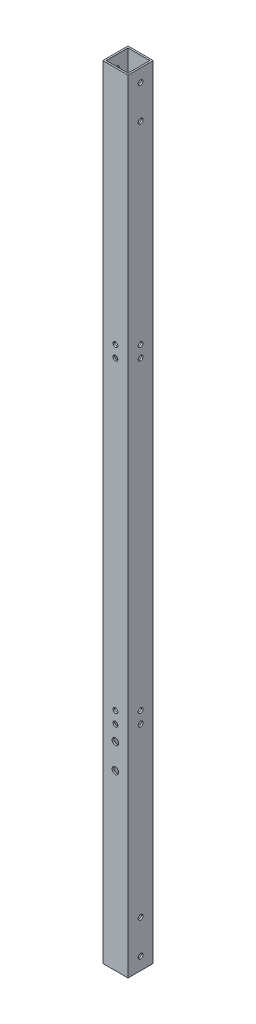
ISO-10303-21;
HEADER;
FILE_DESCRIPTION(('STEP AP214'),'2;1');
FILE_NAME('part.step','',(''),(''),'','','');
FILE_SCHEMA(('AUTOMOTIVE_DESIGN { 1 0 10303 214 1 1 1 1 }'));
ENDSEC;
DATA;
#1=APPLICATION_CONTEXT('core data for automotive mechanical design processes');
#2=APPLICATION_PROTOCOL_DEFINITION('international standard','automotive_design',2000,#1);
#3=PRODUCT_CONTEXT('',#1,'mechanical');
#4=PRODUCT('Part','Part','',(#3));
#5=PRODUCT_RELATED_PRODUCT_CATEGORY('part','',(#4));
#6=PRODUCT_DEFINITION_FORMATION('','',#4);
#7=PRODUCT_DEFINITION_CONTEXT('part definition',#1,'design');
#8=PRODUCT_DEFINITION('design','',#6,#7);
#9=PRODUCT_DEFINITION_SHAPE('','',#8);
#10=(LENGTH_UNIT() NAMED_UNIT(*) SI_UNIT(.MILLI.,.METRE.));
#11=(NAMED_UNIT(*) PLANE_ANGLE_UNIT() SI_UNIT($,.RADIAN.));
#12=(NAMED_UNIT(*) SI_UNIT($,.STERADIAN.) SOLID_ANGLE_UNIT());
#13=UNCERTAINTY_MEASURE_WITH_UNIT(LENGTH_MEASURE(1.E-05),#10,'distance_accuracy_value','');
#14=(GEOMETRIC_REPRESENTATION_CONTEXT(3) GLOBAL_UNCERTAINTY_ASSIGNED_CONTEXT((#13)) GLOBAL_UNIT_ASSIGNED_CONTEXT((#10,
#11,#12)) REPRESENTATION_CONTEXT('',''));
#15=CARTESIAN_POINT('',(0.,0.,0.));
#16=DIRECTION('',(0.,0.,1.));
#17=DIRECTION('',(1.,0.,0.));
#18=AXIS2_PLACEMENT_3D('',#15,#16,#17);
#19=CARTESIAN_POINT('',(0.,465.,0.));
#20=DIRECTION('',(0.,1.,0.));
#21=DIRECTION('',(0.,0.,1.));
#22=AXIS2_PLACEMENT_3D('',#19,#20,#21);
#23=PLANE('',#22);
#24=DIRECTION('',(0.,0.,-1.));
#25=VECTOR('',#24,1.);
#26=CARTESIAN_POINT('',(7.5,465.,7.5));
#27=LINE('',#26,#25);
#28=CARTESIAN_POINT('',(7.5,465.,7.5));
#29=VERTEX_POINT('',#28);
#30=CARTESIAN_POINT('',(7.5,465.,-7.5));
#31=VERTEX_POINT('',#30);
#32=EDGE_CURVE('E187',#29,#31,#27,.T.);
#33=ORIENTED_EDGE('',*,*,#32,.T.);
#34=DIRECTION('',(-1.,0.,0.));
#35=VECTOR('',#34,1.);
#36=CARTESIAN_POINT('',(-7.5,465.,-7.5));
#37=LINE('',#36,#35);
#38=CARTESIAN_POINT('',(-7.5,465.,-7.5));
#39=VERTEX_POINT('',#38);
#40=EDGE_CURVE('E191',#31,#39,#37,.T.);
#41=ORIENTED_EDGE('',*,*,#40,.T.);
#42=DIRECTION('',(0.,0.,1.));
#43=VECTOR('',#42,1.);
#44=CARTESIAN_POINT('',(-7.5,465.,7.5));
#45=LINE('',#44,#43);
#46=CARTESIAN_POINT('',(-7.5,465.,7.5));
#47=VERTEX_POINT('',#46);
#48=EDGE_CURVE('E195',#39,#47,#45,.T.);
#49=ORIENTED_EDGE('',*,*,#48,.T.);
#50=DIRECTION('',(1.,0.,0.));
#51=VECTOR('',#50,1.);
#52=CARTESIAN_POINT('',(-7.5,465.,7.5));
#53=LINE('',#52,#51);
#54=EDGE_CURVE('E198',#47,#29,#53,.T.);
#55=ORIENTED_EDGE('',*,*,#54,.T.);
#56=EDGE_LOOP('',(#33,#41,#49,#55));
#57=FACE_BOUND('',#56,.T.);
#58=DIRECTION('',(-1.,0.,0.));
#59=VECTOR('',#58,1.);
#60=CARTESIAN_POINT('',(0.,465.,-6.5));
#61=LINE('',#60,#59);
#62=CARTESIAN_POINT('',(6.5,465.,-6.5));
#63=VERTEX_POINT('',#62);
#64=CARTESIAN_POINT('',(-6.5,465.,-6.5));
#65=VERTEX_POINT('',#64);
#66=EDGE_CURVE('E146',#63,#65,#61,.T.);
#67=ORIENTED_EDGE('',*,*,#66,.F.);
#68=DIRECTION('',(0.,0.,-1.));
#69=VECTOR('',#68,1.);
#70=CARTESIAN_POINT('',(6.5,465.,0.));
#71=LINE('',#70,#69);
#72=CARTESIAN_POINT('',(6.5,465.,6.5));
#73=VERTEX_POINT('',#72);
#74=EDGE_CURVE('E137',#73,#63,#71,.T.);
#75=ORIENTED_EDGE('',*,*,#74,.F.);
#76=DIRECTION('',(1.,0.,0.));
#77=VECTOR('',#76,1.);
#78=CARTESIAN_POINT('',(0.,465.,6.5));
#79=LINE('',#78,#77);
#80=CARTESIAN_POINT('',(-6.5,465.,6.5));
#81=VERTEX_POINT('',#80);
#82=EDGE_CURVE('E163',#81,#73,#79,.T.);
#83=ORIENTED_EDGE('',*,*,#82,.F.);
#84=DIRECTION('',(0.,0.,1.));
#85=VECTOR('',#84,1.);
#86=CARTESIAN_POINT('',(-6.5,465.,0.));
#87=LINE('',#86,#85);
#88=EDGE_CURVE('E159',#65,#81,#87,.T.);
#89=ORIENTED_EDGE('',*,*,#88,.F.);
#90=EDGE_LOOP('',(#67,#75,#83,#89));
#91=FACE_BOUND('',#90,.T.);
#92=ADVANCED_FACE('F69',(#57,#91),#23,.T.);
#93=CARTESIAN_POINT('',(0.,0.,0.));
#94=DIRECTION('',(0.,1.,0.));
#95=DIRECTION('',(0.,0.,1.));
#96=AXIS2_PLACEMENT_3D('',#93,#94,#95);
#97=PLANE('',#96);
#98=DIRECTION('',(0.,0.,-1.));
#99=VECTOR('',#98,1.);
#100=CARTESIAN_POINT('',(7.5,0.,7.5));
#101=LINE('',#100,#99);
#102=CARTESIAN_POINT('',(7.5,0.,7.5));
#103=VERTEX_POINT('',#102);
#104=CARTESIAN_POINT('',(7.5,0.,-7.5));
#105=VERTEX_POINT('',#104);
#106=EDGE_CURVE('E155',#103,#105,#101,.T.);
#107=ORIENTED_EDGE('',*,*,#106,.F.);
#108=DIRECTION('',(1.,0.,0.));
#109=VECTOR('',#108,1.);
#110=CARTESIAN_POINT('',(-7.5,0.,7.5));
#111=LINE('',#110,#109);
#112=CARTESIAN_POINT('',(-7.5,0.,7.5));
#113=VERTEX_POINT('',#112);
#114=EDGE_CURVE('E192',#113,#103,#111,.T.);
#115=ORIENTED_EDGE('',*,*,#114,.F.);
#116=DIRECTION('',(0.,0.,1.));
#117=VECTOR('',#116,1.);
#118=CARTESIAN_POINT('',(-7.5,0.,7.5));
#119=LINE('',#118,#117);
#120=CARTESIAN_POINT('',(-7.5,0.,-7.5));
#121=VERTEX_POINT('',#120);
#122=EDGE_CURVE('E208',#121,#113,#119,.T.);
#123=ORIENTED_EDGE('',*,*,#122,.F.);
#124=DIRECTION('',(-1.,0.,0.));
#125=VECTOR('',#124,1.);
#126=CARTESIAN_POINT('',(-7.5,0.,-7.5));
#127=LINE('',#126,#125);
#128=EDGE_CURVE('E205',#105,#121,#127,.T.);
#129=ORIENTED_EDGE('',*,*,#128,.F.);
#130=EDGE_LOOP('',(#107,#115,#123,#129));
#131=FACE_BOUND('',#130,.T.);
#132=DIRECTION('',(0.,0.,-1.));
#133=VECTOR('',#132,1.);
#134=CARTESIAN_POINT('',(6.5,0.,0.));
#135=LINE('',#134,#133);
#136=CARTESIAN_POINT('',(6.5,0.,6.5));
#137=VERTEX_POINT('',#136);
#138=CARTESIAN_POINT('',(6.5,0.,-6.5));
#139=VERTEX_POINT('',#138);
#140=EDGE_CURVE('E95',#137,#139,#135,.T.);
#141=ORIENTED_EDGE('',*,*,#140,.T.);
#142=DIRECTION('',(-1.,0.,0.));
#143=VECTOR('',#142,1.);
#144=CARTESIAN_POINT('',(0.,0.,-6.5));
#145=LINE('',#144,#143);
#146=CARTESIAN_POINT('',(-6.5,0.,-6.5));
#147=VERTEX_POINT('',#146);
#148=EDGE_CURVE('E153',#139,#147,#145,.T.);
#149=ORIENTED_EDGE('',*,*,#148,.T.);
#150=DIRECTION('',(0.,0.,1.));
#151=VECTOR('',#150,1.);
#152=CARTESIAN_POINT('',(-6.5,0.,0.));
#153=LINE('',#152,#151);
#154=CARTESIAN_POINT('',(-6.5,0.,6.5));
#155=VERTEX_POINT('',#154);
#156=EDGE_CURVE('E174',#147,#155,#153,.T.);
#157=ORIENTED_EDGE('',*,*,#156,.T.);
#158=DIRECTION('',(1.,0.,0.));
#159=VECTOR('',#158,1.);
#160=CARTESIAN_POINT('',(0.,0.,6.5));
#161=LINE('',#160,#159);
#162=EDGE_CURVE('E147',#155,#137,#161,.T.);
#163=ORIENTED_EDGE('',*,*,#162,.T.);
#164=EDGE_LOOP('',(#141,#149,#157,#163));
#165=FACE_BOUND('',#164,.T.);
#166=ADVANCED_FACE('F409',(#131,#165),#97,.F.);
#167=CARTESIAN_POINT('',(7.5,465.,7.5));
#168=DIRECTION('',(-1.,0.,0.));
#169=DIRECTION('',(0.,0.,1.));
#170=AXIS2_PLACEMENT_3D('',#167,#168,#169);
#171=PLANE('',#170);
#172=CARTESIAN_POINT('',(7.5,457.5,0.));
#173=DIRECTION('',(1.,0.,0.));
#174=DIRECTION('',(0.,0.,-1.));
#175=AXIS2_PLACEMENT_3D('',#172,#173,#174);
#176=CIRCLE('',#175,1.44999999999999);
#177=CARTESIAN_POINT('',(7.5,457.5,-1.44999999999999));
#178=VERTEX_POINT('',#177);
#179=EDGE_CURVE('E482',#178,#178,#176,.T.);
#180=ORIENTED_EDGE('',*,*,#179,.F.);
#181=EDGE_LOOP('',(#180));
#182=FACE_BOUND('',#181,.T.);
#183=CARTESIAN_POINT('',(7.5,322.5,0.));
#184=DIRECTION('',(1.,0.,0.));
#185=DIRECTION('',(0.,0.,-1.));
#186=AXIS2_PLACEMENT_3D('',#183,#184,#185);
#187=CIRCLE('',#186,1.44999999999998);
#188=CARTESIAN_POINT('',(7.5,322.5,-1.44999999999998));
#189=VERTEX_POINT('',#188);
#190=EDGE_CURVE('E468',#189,#189,#187,.T.);
#191=ORIENTED_EDGE('',*,*,#190,.F.);
#192=EDGE_LOOP('',(#191));
#193=FACE_BOUND('',#192,.T.);
#194=CARTESIAN_POINT('',(7.5,7.5,0.));
#195=DIRECTION('',(1.,0.,0.));
#196=DIRECTION('',(0.,0.,-1.));
#197=AXIS2_PLACEMENT_3D('',#194,#195,#196);
#198=CIRCLE('',#197,1.45);
#199=CARTESIAN_POINT('',(7.5,7.5,-1.45));
#200=VERTEX_POINT('',#199);
#201=EDGE_CURVE('E536',#200,#200,#198,.T.);
#202=ORIENTED_EDGE('',*,*,#201,.F.);
#203=EDGE_LOOP('',(#202));
#204=FACE_BOUND('',#203,.T.);
#205=CARTESIAN_POINT('',(7.5,27.5,0.));
#206=DIRECTION('',(1.,0.,0.));
#207=DIRECTION('',(0.,0.,-1.));
#208=AXIS2_PLACEMENT_3D('',#205,#206,#207);
#209=CIRCLE('',#208,1.45);
#210=CARTESIAN_POINT('',(7.5,27.5,-1.45));
#211=VERTEX_POINT('',#210);
#212=EDGE_CURVE('E540',#211,#211,#209,.T.);
#213=ORIENTED_EDGE('',*,*,#212,.F.);
#214=EDGE_LOOP('',(#213));
#215=FACE_BOUND('',#214,.T.);
#216=CARTESIAN_POINT('',(7.5,437.5,0.));
#217=DIRECTION('',(1.,0.,0.));
#218=DIRECTION('',(0.,0.,-1.));
#219=AXIS2_PLACEMENT_3D('',#216,#217,#218);
#220=CIRCLE('',#219,1.44999999999999);
#221=CARTESIAN_POINT('',(7.5,437.5,-1.44999999999999));
#222=VERTEX_POINT('',#221);
#223=EDGE_CURVE('E478',#222,#222,#220,.T.);
#224=ORIENTED_EDGE('',*,*,#223,.F.);
#225=EDGE_LOOP('',(#224));
#226=FACE_BOUND('',#225,.T.);
#227=CARTESIAN_POINT('',(7.5,134.,0.));
#228=DIRECTION('',(1.,0.,0.));
#229=DIRECTION('',(0.,0.,-1.));
#230=AXIS2_PLACEMENT_3D('',#227,#228,#229);
#231=CIRCLE('',#230,1.44999999999999);
#232=CARTESIAN_POINT('',(7.5,134.,-1.44999999999999));
#233=VERTEX_POINT('',#232);
#234=EDGE_CURVE('E485',#233,#233,#231,.T.);
#235=ORIENTED_EDGE('',*,*,#234,.F.);
#236=EDGE_LOOP('',(#235));
#237=FACE_BOUND('',#236,.T.);
#238=CARTESIAN_POINT('',(7.5,127.,0.));
#239=DIRECTION('',(1.,0.,0.));
#240=DIRECTION('',(0.,0.,-1.));
#241=AXIS2_PLACEMENT_3D('',#238,#239,#240);
#242=CIRCLE('',#241,1.45000000000001);
#243=CARTESIAN_POINT('',(7.5,127.,-1.45000000000001));
#244=VERTEX_POINT('',#243);
#245=EDGE_CURVE('E491',#244,#244,#242,.T.);
#246=ORIENTED_EDGE('',*,*,#245,.F.);
#247=EDGE_LOOP('',(#246));
#248=FACE_BOUND('',#247,.T.);
#249=CARTESIAN_POINT('',(7.5,315.5,0.));
#250=DIRECTION('',(1.,0.,0.));
#251=DIRECTION('',(0.,0.,-1.));
#252=AXIS2_PLACEMENT_3D('',#249,#250,#251);
#253=CIRCLE('',#252,1.44999999999998);
#254=CARTESIAN_POINT('',(7.5,315.5,-1.44999999999998));
#255=VERTEX_POINT('',#254);
#256=EDGE_CURVE('E467',#255,#255,#253,.T.);
#257=ORIENTED_EDGE('',*,*,#256,.F.);
#258=EDGE_LOOP('',(#257));
#259=FACE_BOUND('',#258,.T.);
#260=ORIENTED_EDGE('',*,*,#106,.T.);
#261=DIRECTION('',(0.,-1.,0.));
#262=VECTOR('',#261,1.);
#263=CARTESIAN_POINT('',(7.5,465.,-7.5));
#264=LINE('',#263,#262);
#265=EDGE_CURVE('E12',#31,#105,#264,.T.);
#266=ORIENTED_EDGE('',*,*,#265,.F.);
#267=ORIENTED_EDGE('',*,*,#32,.F.);
#268=DIRECTION('',(0.,-1.,0.));
#269=VECTOR('',#268,1.);
#270=CARTESIAN_POINT('',(7.5,465.,7.5));
#271=LINE('',#270,#269);
#272=EDGE_CURVE('E201',#29,#103,#271,.T.);
#273=ORIENTED_EDGE('',*,*,#272,.T.);
#274=EDGE_LOOP('',(#260,#266,#267,#273));
#275=FACE_BOUND('',#274,.T.);
#276=ADVANCED_FACE('F71',(#182,#193,#204,#215,#226,#237,#248,#259,#275),#171,.F.);
#277=CARTESIAN_POINT('',(-7.5,465.,-7.5));
#278=DIRECTION('',(0.,0.,1.));
#279=DIRECTION('',(1.,0.,0.));
#280=AXIS2_PLACEMENT_3D('',#277,#278,#279);
#281=PLANE('',#280);
#282=CARTESIAN_POINT('',(0.,322.5,-7.5));
#283=DIRECTION('',(0.,0.,1.));
#284=DIRECTION('',(1.,0.,0.));
#285=AXIS2_PLACEMENT_3D('',#282,#283,#284);
#286=CIRCLE('',#285,1.44999999999999);
#287=CARTESIAN_POINT('',(1.44999999999999,322.5,-7.5));
#288=VERTEX_POINT('',#287);
#289=EDGE_CURVE('E309',#288,#288,#286,.T.);
#290=ORIENTED_EDGE('',*,*,#289,.T.);
#291=EDGE_LOOP('',(#290));
#292=FACE_BOUND('',#291,.T.);
#293=CARTESIAN_POINT('',(0.,127.,-7.5));
#294=DIRECTION('',(0.,0.,1.));
#295=DIRECTION('',(1.,0.,0.));
#296=AXIS2_PLACEMENT_3D('',#293,#294,#295);
#297=CIRCLE('',#296,1.45);
#298=CARTESIAN_POINT('',(1.45,127.,-7.5));
#299=VERTEX_POINT('',#298);
#300=EDGE_CURVE('E318',#299,#299,#297,.T.);
#301=ORIENTED_EDGE('',*,*,#300,.T.);
#302=EDGE_LOOP('',(#301));
#303=FACE_BOUND('',#302,.T.);
#304=CARTESIAN_POINT('',(0.,134.,-7.5));
#305=DIRECTION('',(0.,0.,1.));
#306=DIRECTION('',(1.,0.,0.));
#307=AXIS2_PLACEMENT_3D('',#304,#305,#306);
#308=CIRCLE('',#307,1.45);
#309=CARTESIAN_POINT('',(1.45,134.,-7.5));
#310=VERTEX_POINT('',#309);
#311=EDGE_CURVE('E317',#310,#310,#308,.T.);
#312=ORIENTED_EDGE('',*,*,#311,.T.);
#313=EDGE_LOOP('',(#312));
#314=FACE_BOUND('',#313,.T.);
#315=CARTESIAN_POINT('',(0.,103.,-7.5));
#316=DIRECTION('',(0.,0.,1.));
#317=DIRECTION('',(1.,0.,0.));
#318=AXIS2_PLACEMENT_3D('',#315,#316,#317);
#319=CIRCLE('',#318,1.95);
#320=CARTESIAN_POINT('',(1.95,103.,-7.5));
#321=VERTEX_POINT('',#320);
#322=EDGE_CURVE('E334',#321,#321,#319,.T.);
#323=ORIENTED_EDGE('',*,*,#322,.T.);
#324=EDGE_LOOP('',(#323));
#325=FACE_BOUND('',#324,.T.);
#326=CARTESIAN_POINT('',(0.,315.5,-7.5));
#327=DIRECTION('',(0.,0.,1.));
#328=DIRECTION('',(1.,0.,0.));
#329=AXIS2_PLACEMENT_3D('',#326,#327,#328);
#330=CIRCLE('',#329,1.44999999999999);
#331=CARTESIAN_POINT('',(1.44999999999999,315.5,-7.5));
#332=VERTEX_POINT('',#331);
#333=EDGE_CURVE('E304',#332,#332,#330,.T.);
#334=ORIENTED_EDGE('',*,*,#333,.T.);
#335=EDGE_LOOP('',(#334));
#336=FACE_BOUND('',#335,.T.);
#337=CARTESIAN_POINT('',(0.,118.,-7.5));
#338=DIRECTION('',(0.,0.,1.));
#339=DIRECTION('',(1.,0.,0.));
#340=AXIS2_PLACEMENT_3D('',#337,#338,#339);
#341=CIRCLE('',#340,1.95);
#342=CARTESIAN_POINT('',(1.95,118.,-7.5));
#343=VERTEX_POINT('',#342);
#344=EDGE_CURVE('E228',#343,#343,#341,.T.);
#345=ORIENTED_EDGE('',*,*,#344,.T.);
#346=EDGE_LOOP('',(#345));
#347=FACE_BOUND('',#346,.T.);
#348=ORIENTED_EDGE('',*,*,#128,.T.);
#349=DIRECTION('',(0.,-1.,0.));
#350=VECTOR('',#349,1.);
#351=CARTESIAN_POINT('',(-7.5,465.,-7.5));
#352=LINE('',#351,#350);
#353=EDGE_CURVE('E79',#39,#121,#352,.T.);
#354=ORIENTED_EDGE('',*,*,#353,.F.);
#355=ORIENTED_EDGE('',*,*,#40,.F.);
#356=ORIENTED_EDGE('',*,*,#265,.T.);
#357=EDGE_LOOP('',(#348,#354,#355,#356));
#358=FACE_BOUND('',#357,.T.);
#359=ADVANCED_FACE('F395',(#292,#303,#314,#325,#336,#347,#358),#281,.F.);
#360=CARTESIAN_POINT('',(-7.5,465.,7.5));
#361=DIRECTION('',(1.,0.,0.));
#362=DIRECTION('',(0.,0.,-1.));
#363=AXIS2_PLACEMENT_3D('',#360,#361,#362);
#364=PLANE('',#363);
#365=CARTESIAN_POINT('',(-7.5,457.5,0.));
#366=DIRECTION('',(1.,0.,0.));
#367=DIRECTION('',(0.,0.,-1.));
#368=AXIS2_PLACEMENT_3D('',#365,#366,#367);
#369=CIRCLE('',#368,1.44999999999999);
#370=CARTESIAN_POINT('',(-7.5,457.5,-1.44999999999999));
#371=VERTEX_POINT('',#370);
#372=EDGE_CURVE('E258',#371,#371,#369,.T.);
#373=ORIENTED_EDGE('',*,*,#372,.T.);
#374=EDGE_LOOP('',(#373));
#375=FACE_BOUND('',#374,.T.);
#376=CARTESIAN_POINT('',(-7.5,322.5,0.));
#377=DIRECTION('',(1.,0.,0.));
#378=DIRECTION('',(0.,0.,-1.));
#379=AXIS2_PLACEMENT_3D('',#376,#377,#378);
#380=CIRCLE('',#379,1.44999999999998);
#381=CARTESIAN_POINT('',(-7.5,322.5,-1.44999999999998));
#382=VERTEX_POINT('',#381);
#383=EDGE_CURVE('E441',#382,#382,#380,.T.);
#384=ORIENTED_EDGE('',*,*,#383,.T.);
#385=EDGE_LOOP('',(#384));
#386=FACE_BOUND('',#385,.T.);
#387=CARTESIAN_POINT('',(-7.5,7.5,0.));
#388=DIRECTION('',(1.,0.,0.));
#389=DIRECTION('',(0.,0.,-1.));
#390=AXIS2_PLACEMENT_3D('',#387,#388,#389);
#391=CIRCLE('',#390,1.45);
#392=CARTESIAN_POINT('',(-7.5,7.5,-1.45));
#393=VERTEX_POINT('',#392);
#394=EDGE_CURVE('E445',#393,#393,#391,.T.);
#395=ORIENTED_EDGE('',*,*,#394,.T.);
#396=EDGE_LOOP('',(#395));
#397=FACE_BOUND('',#396,.T.);
#398=CARTESIAN_POINT('',(-7.5,27.5,0.));
#399=DIRECTION('',(1.,0.,0.));
#400=DIRECTION('',(0.,0.,-1.));
#401=AXIS2_PLACEMENT_3D('',#398,#399,#400);
#402=CIRCLE('',#401,1.45);
#403=CARTESIAN_POINT('',(-7.5,27.5,-1.45));
#404=VERTEX_POINT('',#403);
#405=EDGE_CURVE('E449',#404,#404,#402,.T.);
#406=ORIENTED_EDGE('',*,*,#405,.T.);
#407=EDGE_LOOP('',(#406));
#408=FACE_BOUND('',#407,.T.);
#409=CARTESIAN_POINT('',(-7.5,437.5,0.));
#410=DIRECTION('',(1.,0.,0.));
#411=DIRECTION('',(0.,0.,-1.));
#412=AXIS2_PLACEMENT_3D('',#409,#410,#411);
#413=CIRCLE('',#412,1.44999999999999);
#414=CARTESIAN_POINT('',(-7.5,437.5,-1.44999999999999));
#415=VERTEX_POINT('',#414);
#416=EDGE_CURVE('E453',#415,#415,#413,.T.);
#417=ORIENTED_EDGE('',*,*,#416,.T.);
#418=EDGE_LOOP('',(#417));
#419=FACE_BOUND('',#418,.T.);
#420=CARTESIAN_POINT('',(-7.5,134.,0.));
#421=DIRECTION('',(1.,0.,0.));
#422=DIRECTION('',(0.,0.,-1.));
#423=AXIS2_PLACEMENT_3D('',#420,#421,#422);
#424=CIRCLE('',#423,1.44999999999999);
#425=CARTESIAN_POINT('',(-7.5,134.,-1.44999999999999));
#426=VERTEX_POINT('',#425);
#427=EDGE_CURVE('E457',#426,#426,#424,.T.);
#428=ORIENTED_EDGE('',*,*,#427,.T.);
#429=EDGE_LOOP('',(#428));
#430=FACE_BOUND('',#429,.T.);
#431=CARTESIAN_POINT('',(-7.5,127.,0.));
#432=DIRECTION('',(1.,0.,0.));
#433=DIRECTION('',(0.,0.,-1.));
#434=AXIS2_PLACEMENT_3D('',#431,#432,#433);
#435=CIRCLE('',#434,1.45000000000001);
#436=CARTESIAN_POINT('',(-7.5,127.,-1.45000000000001));
#437=VERTEX_POINT('',#436);
#438=EDGE_CURVE('E461',#437,#437,#435,.T.);
#439=ORIENTED_EDGE('',*,*,#438,.T.);
#440=EDGE_LOOP('',(#439));
#441=FACE_BOUND('',#440,.T.);
#442=CARTESIAN_POINT('',(-7.5,315.5,0.));
#443=DIRECTION('',(1.,0.,0.));
#444=DIRECTION('',(0.,0.,-1.));
#445=AXIS2_PLACEMENT_3D('',#442,#443,#444);
#446=CIRCLE('',#445,1.44999999999998);
#447=CARTESIAN_POINT('',(-7.5,315.5,-1.44999999999998));
#448=VERTEX_POINT('',#447);
#449=EDGE_CURVE('E464',#448,#448,#446,.T.);
#450=ORIENTED_EDGE('',*,*,#449,.T.);
#451=EDGE_LOOP('',(#450));
#452=FACE_BOUND('',#451,.T.);
#453=ORIENTED_EDGE('',*,*,#122,.T.);
#454=DIRECTION('',(0.,-1.,0.));
#455=VECTOR('',#454,1.);
#456=CARTESIAN_POINT('',(-7.5,465.,7.5));
#457=LINE('',#456,#455);
#458=EDGE_CURVE('E216',#47,#113,#457,.T.);
#459=ORIENTED_EDGE('',*,*,#458,.F.);
#460=ORIENTED_EDGE('',*,*,#48,.F.);
#461=ORIENTED_EDGE('',*,*,#353,.T.);
#462=EDGE_LOOP('',(#453,#459,#460,#461));
#463=FACE_BOUND('',#462,.T.);
#464=ADVANCED_FACE('F398',(#375,#386,#397,#408,#419,#430,#441,#452,#463),#364,.F.);
#465=CARTESIAN_POINT('',(-7.5,465.,7.5));
#466=DIRECTION('',(0.,0.,-1.));
#467=DIRECTION('',(-1.,0.,0.));
#468=AXIS2_PLACEMENT_3D('',#465,#466,#467);
#469=PLANE('',#468);
#470=CARTESIAN_POINT('',(0.,322.5,7.5));
#471=DIRECTION('',(0.,0.,1.));
#472=DIRECTION('',(1.,0.,0.));
#473=AXIS2_PLACEMENT_3D('',#470,#471,#472);
#474=CIRCLE('',#473,1.44999999999999);
#475=CARTESIAN_POINT('',(1.44999999999999,322.5,7.5));
#476=VERTEX_POINT('',#475);
#477=EDGE_CURVE('E322',#476,#476,#474,.T.);
#478=ORIENTED_EDGE('',*,*,#477,.F.);
#479=EDGE_LOOP('',(#478));
#480=FACE_BOUND('',#479,.T.);
#481=CARTESIAN_POINT('',(0.,127.,7.5));
#482=DIRECTION('',(0.,0.,1.));
#483=DIRECTION('',(1.,0.,0.));
#484=AXIS2_PLACEMENT_3D('',#481,#482,#483);
#485=CIRCLE('',#484,1.45);
#486=CARTESIAN_POINT('',(1.45,127.,7.5));
#487=VERTEX_POINT('',#486);
#488=EDGE_CURVE('E313',#487,#487,#485,.T.);
#489=ORIENTED_EDGE('',*,*,#488,.F.);
#490=EDGE_LOOP('',(#489));
#491=FACE_BOUND('',#490,.T.);
#492=CARTESIAN_POINT('',(0.,134.,7.5));
#493=DIRECTION('',(0.,0.,1.));
#494=DIRECTION('',(1.,0.,0.));
#495=AXIS2_PLACEMENT_3D('',#492,#493,#494);
#496=CIRCLE('',#495,1.45);
#497=CARTESIAN_POINT('',(1.45,134.,7.5));
#498=VERTEX_POINT('',#497);
#499=EDGE_CURVE('E338',#498,#498,#496,.T.);
#500=ORIENTED_EDGE('',*,*,#499,.F.);
#501=EDGE_LOOP('',(#500));
#502=FACE_BOUND('',#501,.T.);
#503=CARTESIAN_POINT('',(0.,103.,7.5));
#504=DIRECTION('',(0.,0.,1.));
#505=DIRECTION('',(1.,0.,0.));
#506=AXIS2_PLACEMENT_3D('',#503,#504,#505);
#507=CIRCLE('',#506,1.95);
#508=CARTESIAN_POINT('',(1.95,103.,7.5));
#509=VERTEX_POINT('',#508);
#510=EDGE_CURVE('E329',#509,#509,#507,.T.);
#511=ORIENTED_EDGE('',*,*,#510,.F.);
#512=EDGE_LOOP('',(#511));
#513=FACE_BOUND('',#512,.T.);
#514=CARTESIAN_POINT('',(0.,315.5,7.5));
#515=DIRECTION('',(0.,0.,1.));
#516=DIRECTION('',(1.,0.,0.));
#517=AXIS2_PLACEMENT_3D('',#514,#515,#516);
#518=CIRCLE('',#517,1.44999999999999);
#519=CARTESIAN_POINT('',(1.44999999999999,315.5,7.5));
#520=VERTEX_POINT('',#519);
#521=EDGE_CURVE('E305',#520,#520,#518,.T.);
#522=ORIENTED_EDGE('',*,*,#521,.F.);
#523=EDGE_LOOP('',(#522));
#524=FACE_BOUND('',#523,.T.);
#525=CARTESIAN_POINT('',(0.,118.,7.5));
#526=DIRECTION('',(0.,0.,1.));
#527=DIRECTION('',(1.,0.,0.));
#528=AXIS2_PLACEMENT_3D('',#525,#526,#527);
#529=CIRCLE('',#528,1.95);
#530=CARTESIAN_POINT('',(1.95,118.,7.5));
#531=VERTEX_POINT('',#530);
#532=EDGE_CURVE('E333',#531,#531,#529,.T.);
#533=ORIENTED_EDGE('',*,*,#532,.F.);
#534=EDGE_LOOP('',(#533));
#535=FACE_BOUND('',#534,.T.);
#536=ORIENTED_EDGE('',*,*,#114,.T.);
#537=ORIENTED_EDGE('',*,*,#272,.F.);
#538=ORIENTED_EDGE('',*,*,#54,.F.);
#539=ORIENTED_EDGE('',*,*,#458,.T.);
#540=EDGE_LOOP('',(#536,#537,#538,#539));
#541=FACE_BOUND('',#540,.T.);
#542=ADVANCED_FACE('F413',(#480,#491,#502,#513,#524,#535,#541),#469,.F.);
#543=CARTESIAN_POINT('',(6.5,465.,0.));
#544=DIRECTION('',(-1.,0.,0.));
#545=DIRECTION('',(0.,0.,1.));
#546=AXIS2_PLACEMENT_3D('',#543,#544,#545);
#547=PLANE('',#546);
#548=CARTESIAN_POINT('',(6.5,457.5,0.));
#549=DIRECTION('',(-1.,0.,0.));
#550=DIRECTION('',(0.,0.,1.));
#551=AXIS2_PLACEMENT_3D('',#548,#549,#550);
#552=CIRCLE('',#551,1.44999999999999);
#553=CARTESIAN_POINT('',(6.5,457.5,1.44999999999999));
#554=VERTEX_POINT('',#553);
#555=EDGE_CURVE('E300',#554,#554,#552,.T.);
#556=ORIENTED_EDGE('',*,*,#555,.F.);
#557=EDGE_LOOP('',(#556));
#558=FACE_BOUND('',#557,.T.);
#559=CARTESIAN_POINT('',(6.5,322.5,0.));
#560=DIRECTION('',(-1.,0.,0.));
#561=DIRECTION('',(0.,0.,1.));
#562=AXIS2_PLACEMENT_3D('',#559,#560,#561);
#563=CIRCLE('',#562,1.44999999999998);
#564=CARTESIAN_POINT('',(6.5,322.5,1.44999999999998));
#565=VERTEX_POINT('',#564);
#566=EDGE_CURVE('E286',#565,#565,#563,.T.);
#567=ORIENTED_EDGE('',*,*,#566,.F.);
#568=EDGE_LOOP('',(#567));
#569=FACE_BOUND('',#568,.T.);
#570=CARTESIAN_POINT('',(6.5,7.5,0.));
#571=DIRECTION('',(-1.,0.,0.));
#572=DIRECTION('',(0.,0.,1.));
#573=AXIS2_PLACEMENT_3D('',#570,#571,#572);
#574=CIRCLE('',#573,1.45);
#575=CARTESIAN_POINT('',(6.5,7.5,1.45));
#576=VERTEX_POINT('',#575);
#577=EDGE_CURVE('E282',#576,#576,#574,.T.);
#578=ORIENTED_EDGE('',*,*,#577,.F.);
#579=EDGE_LOOP('',(#578));
#580=FACE_BOUND('',#579,.T.);
#581=CARTESIAN_POINT('',(6.5,27.5,0.));
#582=DIRECTION('',(-1.,0.,0.));
#583=DIRECTION('',(0.,0.,1.));
#584=AXIS2_PLACEMENT_3D('',#581,#582,#583);
#585=CIRCLE('',#584,1.45);
#586=CARTESIAN_POINT('',(6.5,27.5,1.45));
#587=VERTEX_POINT('',#586);
#588=EDGE_CURVE('E278',#587,#587,#585,.T.);
#589=ORIENTED_EDGE('',*,*,#588,.F.);
#590=EDGE_LOOP('',(#589));
#591=FACE_BOUND('',#590,.T.);
#592=CARTESIAN_POINT('',(6.5,437.5,0.));
#593=DIRECTION('',(-1.,0.,0.));
#594=DIRECTION('',(0.,0.,1.));
#595=AXIS2_PLACEMENT_3D('',#592,#593,#594);
#596=CIRCLE('',#595,1.44999999999999);
#597=CARTESIAN_POINT('',(6.5,437.5,1.44999999999999));
#598=VERTEX_POINT('',#597);
#599=EDGE_CURVE('E273',#598,#598,#596,.T.);
#600=ORIENTED_EDGE('',*,*,#599,.F.);
#601=EDGE_LOOP('',(#600));
#602=FACE_BOUND('',#601,.T.);
#603=CARTESIAN_POINT('',(6.5,134.,0.));
#604=DIRECTION('',(-1.,0.,0.));
#605=DIRECTION('',(0.,0.,1.));
#606=AXIS2_PLACEMENT_3D('',#603,#604,#605);
#607=CIRCLE('',#606,1.44999999999999);
#608=CARTESIAN_POINT('',(6.5,134.,1.44999999999999));
#609=VERTEX_POINT('',#608);
#610=EDGE_CURVE('E268',#609,#609,#607,.T.);
#611=ORIENTED_EDGE('',*,*,#610,.F.);
#612=EDGE_LOOP('',(#611));
#613=FACE_BOUND('',#612,.T.);
#614=CARTESIAN_POINT('',(6.5,127.,0.));
#615=DIRECTION('',(-1.,0.,0.));
#616=DIRECTION('',(0.,0.,1.));
#617=AXIS2_PLACEMENT_3D('',#614,#615,#616);
#618=CIRCLE('',#617,1.45000000000001);
#619=CARTESIAN_POINT('',(6.5,127.,1.45000000000001));
#620=VERTEX_POINT('',#619);
#621=EDGE_CURVE('E263',#620,#620,#618,.T.);
#622=ORIENTED_EDGE('',*,*,#621,.F.);
#623=EDGE_LOOP('',(#622));
#624=FACE_BOUND('',#623,.T.);
#625=CARTESIAN_POINT('',(6.5,315.5,0.));
#626=DIRECTION('',(-1.,0.,0.));
#627=DIRECTION('',(0.,0.,1.));
#628=AXIS2_PLACEMENT_3D('',#625,#626,#627);
#629=CIRCLE('',#628,1.44999999999998);
#630=CARTESIAN_POINT('',(6.5,315.5,1.44999999999998));
#631=VERTEX_POINT('',#630);
#632=EDGE_CURVE('E257',#631,#631,#629,.T.);
#633=ORIENTED_EDGE('',*,*,#632,.F.);
#634=EDGE_LOOP('',(#633));
#635=FACE_BOUND('',#634,.T.);
#636=ORIENTED_EDGE('',*,*,#140,.F.);
#637=DIRECTION('',(0.,-1.,0.));
#638=VECTOR('',#637,1.);
#639=CARTESIAN_POINT('',(6.5,465.,6.5));
#640=LINE('',#639,#638);
#641=EDGE_CURVE('E141',#73,#137,#640,.T.);
#642=ORIENTED_EDGE('',*,*,#641,.F.);
#643=ORIENTED_EDGE('',*,*,#74,.T.);
#644=DIRECTION('',(0.,-1.,0.));
#645=VECTOR('',#644,1.);
#646=CARTESIAN_POINT('',(6.5,465.,-6.5));
#647=LINE('',#646,#645);
#648=EDGE_CURVE('E140',#63,#139,#647,.T.);
#649=ORIENTED_EDGE('',*,*,#648,.T.);
#650=EDGE_LOOP('',(#636,#642,#643,#649));
#651=FACE_BOUND('',#650,.T.);
#652=ADVANCED_FACE('F139',(#558,#569,#580,#591,#602,#613,#624,#635,#651),#547,.T.);
#653=CARTESIAN_POINT('',(0.,465.,-6.5));
#654=DIRECTION('',(0.,0.,1.));
#655=DIRECTION('',(1.,0.,0.));
#656=AXIS2_PLACEMENT_3D('',#653,#654,#655);
#657=PLANE('',#656);
#658=CARTESIAN_POINT('',(0.,322.5,-6.5));
#659=DIRECTION('',(0.,0.,1.));
#660=DIRECTION('',(1.,0.,0.));
#661=AXIS2_PLACEMENT_3D('',#658,#659,#660);
#662=CIRCLE('',#661,1.44999999999999);
#663=CARTESIAN_POINT('',(1.44999999999999,322.5,-6.5));
#664=VERTEX_POINT('',#663);
#665=EDGE_CURVE('E171',#664,#664,#662,.T.);
#666=ORIENTED_EDGE('',*,*,#665,.F.);
#667=EDGE_LOOP('',(#666));
#668=FACE_BOUND('',#667,.T.);
#669=CARTESIAN_POINT('',(0.,127.,-6.5));
#670=DIRECTION('',(0.,0.,1.));
#671=DIRECTION('',(1.,0.,0.));
#672=AXIS2_PLACEMENT_3D('',#669,#670,#671);
#673=CIRCLE('',#672,1.45);
#674=CARTESIAN_POINT('',(1.45,127.,-6.5));
#675=VERTEX_POINT('',#674);
#676=EDGE_CURVE('E248',#675,#675,#673,.T.);
#677=ORIENTED_EDGE('',*,*,#676,.F.);
#678=EDGE_LOOP('',(#677));
#679=FACE_BOUND('',#678,.T.);
#680=CARTESIAN_POINT('',(0.,134.,-6.5));
#681=DIRECTION('',(0.,0.,1.));
#682=DIRECTION('',(1.,0.,0.));
#683=AXIS2_PLACEMENT_3D('',#680,#681,#682);
#684=CIRCLE('',#683,1.45);
#685=CARTESIAN_POINT('',(1.45,134.,-6.5));
#686=VERTEX_POINT('',#685);
#687=EDGE_CURVE('E243',#686,#686,#684,.T.);
#688=ORIENTED_EDGE('',*,*,#687,.F.);
#689=EDGE_LOOP('',(#688));
#690=FACE_BOUND('',#689,.T.);
#691=CARTESIAN_POINT('',(0.,103.,-6.5));
#692=DIRECTION('',(0.,0.,1.));
#693=DIRECTION('',(1.,0.,0.));
#694=AXIS2_PLACEMENT_3D('',#691,#692,#693);
#695=CIRCLE('',#694,1.95);
#696=CARTESIAN_POINT('',(1.95,103.,-6.5));
#697=VERTEX_POINT('',#696);
#698=EDGE_CURVE('E238',#697,#697,#695,.T.);
#699=ORIENTED_EDGE('',*,*,#698,.F.);
#700=EDGE_LOOP('',(#699));
#701=FACE_BOUND('',#700,.T.);
#702=CARTESIAN_POINT('',(0.,315.5,-6.5));
#703=DIRECTION('',(0.,0.,1.));
#704=DIRECTION('',(1.,0.,0.));
#705=AXIS2_PLACEMENT_3D('',#702,#703,#704);
#706=CIRCLE('',#705,1.44999999999999);
#707=CARTESIAN_POINT('',(1.44999999999999,315.5,-6.5));
#708=VERTEX_POINT('',#707);
#709=EDGE_CURVE('E233',#708,#708,#706,.T.);
#710=ORIENTED_EDGE('',*,*,#709,.F.);
#711=EDGE_LOOP('',(#710));
#712=FACE_BOUND('',#711,.T.);
#713=CARTESIAN_POINT('',(0.,118.,-6.5));
#714=DIRECTION('',(0.,0.,1.));
#715=DIRECTION('',(1.,0.,0.));
#716=AXIS2_PLACEMENT_3D('',#713,#714,#715);
#717=CIRCLE('',#716,1.95);
#718=CARTESIAN_POINT('',(1.95,118.,-6.5));
#719=VERTEX_POINT('',#718);
#720=EDGE_CURVE('E227',#719,#719,#717,.T.);
#721=ORIENTED_EDGE('',*,*,#720,.F.);
#722=EDGE_LOOP('',(#721));
#723=FACE_BOUND('',#722,.T.);
#724=ORIENTED_EDGE('',*,*,#148,.F.);
#725=ORIENTED_EDGE('',*,*,#648,.F.);
#726=ORIENTED_EDGE('',*,*,#66,.T.);
#727=DIRECTION('',(0.,-1.,0.));
#728=VECTOR('',#727,1.);
#729=CARTESIAN_POINT('',(-6.5,465.,-6.5));
#730=LINE('',#729,#728);
#731=EDGE_CURVE('E156',#65,#147,#730,.T.);
#732=ORIENTED_EDGE('',*,*,#731,.T.);
#733=EDGE_LOOP('',(#724,#725,#726,#732));
#734=FACE_BOUND('',#733,.T.);
#735=ADVANCED_FACE('F150',(#668,#679,#690,#701,#712,#723,#734),#657,.T.);
#736=CARTESIAN_POINT('',(-6.5,465.,0.));
#737=DIRECTION('',(1.,0.,0.));
#738=DIRECTION('',(0.,0.,-1.));
#739=AXIS2_PLACEMENT_3D('',#736,#737,#738);
#740=PLANE('',#739);
#741=CARTESIAN_POINT('',(-6.5,457.5,0.));
#742=DIRECTION('',(1.,0.,0.));
#743=DIRECTION('',(0.,0.,-1.));
#744=AXIS2_PLACEMENT_3D('',#741,#742,#743);
#745=CIRCLE('',#744,1.44999999999999);
#746=CARTESIAN_POINT('',(-6.5,457.5,-1.44999999999999));
#747=VERTEX_POINT('',#746);
#748=EDGE_CURVE('E73',#747,#747,#745,.T.);
#749=ORIENTED_EDGE('',*,*,#748,.F.);
#750=EDGE_LOOP('',(#749));
#751=FACE_BOUND('',#750,.T.);
#752=CARTESIAN_POINT('',(-6.5,322.5,0.));
#753=DIRECTION('',(1.,0.,0.));
#754=DIRECTION('',(0.,0.,-1.));
#755=AXIS2_PLACEMENT_3D('',#752,#753,#754);
#756=CIRCLE('',#755,1.44999999999998);
#757=CARTESIAN_POINT('',(-6.5,322.5,-1.44999999999998));
#758=VERTEX_POINT('',#757);
#759=EDGE_CURVE('E283',#758,#758,#756,.T.);
#760=ORIENTED_EDGE('',*,*,#759,.F.);
#761=EDGE_LOOP('',(#760));
#762=FACE_BOUND('',#761,.T.);
#763=CARTESIAN_POINT('',(-6.5,7.5,0.));
#764=DIRECTION('',(1.,0.,0.));
#765=DIRECTION('',(0.,0.,-1.));
#766=AXIS2_PLACEMENT_3D('',#763,#764,#765);
#767=CIRCLE('',#766,1.45);
#768=CARTESIAN_POINT('',(-6.5,7.5,-1.45));
#769=VERTEX_POINT('',#768);
#770=EDGE_CURVE('E279',#769,#769,#767,.T.);
#771=ORIENTED_EDGE('',*,*,#770,.F.);
#772=EDGE_LOOP('',(#771));
#773=FACE_BOUND('',#772,.T.);
#774=CARTESIAN_POINT('',(-6.5,27.5,0.));
#775=DIRECTION('',(1.,0.,0.));
#776=DIRECTION('',(0.,0.,-1.));
#777=AXIS2_PLACEMENT_3D('',#774,#775,#776);
#778=CIRCLE('',#777,1.45);
#779=CARTESIAN_POINT('',(-6.5,27.5,-1.45));
#780=VERTEX_POINT('',#779);
#781=EDGE_CURVE('E274',#780,#780,#778,.T.);
#782=ORIENTED_EDGE('',*,*,#781,.F.);
#783=EDGE_LOOP('',(#782));
#784=FACE_BOUND('',#783,.T.);
#785=CARTESIAN_POINT('',(-6.5,437.5,0.));
#786=DIRECTION('',(1.,0.,0.));
#787=DIRECTION('',(0.,0.,-1.));
#788=AXIS2_PLACEMENT_3D('',#785,#786,#787);
#789=CIRCLE('',#788,1.44999999999999);
#790=CARTESIAN_POINT('',(-6.5,437.5,-1.44999999999999));
#791=VERTEX_POINT('',#790);
#792=EDGE_CURVE('E269',#791,#791,#789,.T.);
#793=ORIENTED_EDGE('',*,*,#792,.F.);
#794=EDGE_LOOP('',(#793));
#795=FACE_BOUND('',#794,.T.);
#796=CARTESIAN_POINT('',(-6.5,134.,0.));
#797=DIRECTION('',(1.,0.,0.));
#798=DIRECTION('',(0.,0.,-1.));
#799=AXIS2_PLACEMENT_3D('',#796,#797,#798);
#800=CIRCLE('',#799,1.44999999999999);
#801=CARTESIAN_POINT('',(-6.5,134.,-1.44999999999999));
#802=VERTEX_POINT('',#801);
#803=EDGE_CURVE('E264',#802,#802,#800,.T.);
#804=ORIENTED_EDGE('',*,*,#803,.F.);
#805=EDGE_LOOP('',(#804));
#806=FACE_BOUND('',#805,.T.);
#807=CARTESIAN_POINT('',(-6.5,127.,0.));
#808=DIRECTION('',(1.,0.,0.));
#809=DIRECTION('',(0.,0.,-1.));
#810=AXIS2_PLACEMENT_3D('',#807,#808,#809);
#811=CIRCLE('',#810,1.45000000000001);
#812=CARTESIAN_POINT('',(-6.5,127.,-1.45000000000001));
#813=VERTEX_POINT('',#812);
#814=EDGE_CURVE('E259',#813,#813,#811,.T.);
#815=ORIENTED_EDGE('',*,*,#814,.F.);
#816=EDGE_LOOP('',(#815));
#817=FACE_BOUND('',#816,.T.);
#818=CARTESIAN_POINT('',(-6.5,315.5,0.));
#819=DIRECTION('',(1.,0.,0.));
#820=DIRECTION('',(0.,0.,-1.));
#821=AXIS2_PLACEMENT_3D('',#818,#819,#820);
#822=CIRCLE('',#821,1.44999999999998);
#823=CARTESIAN_POINT('',(-6.5,315.5,-1.44999999999998));
#824=VERTEX_POINT('',#823);
#825=EDGE_CURVE('E253',#824,#824,#822,.T.);
#826=ORIENTED_EDGE('',*,*,#825,.F.);
#827=EDGE_LOOP('',(#826));
#828=FACE_BOUND('',#827,.T.);
#829=ORIENTED_EDGE('',*,*,#156,.F.);
#830=ORIENTED_EDGE('',*,*,#731,.F.);
#831=ORIENTED_EDGE('',*,*,#88,.T.);
#832=DIRECTION('',(0.,-1.,0.));
#833=VECTOR('',#832,1.);
#834=CARTESIAN_POINT('',(-6.5,465.,6.5));
#835=LINE('',#834,#833);
#836=EDGE_CURVE('E87',#81,#155,#835,.T.);
#837=ORIENTED_EDGE('',*,*,#836,.T.);
#838=EDGE_LOOP('',(#829,#830,#831,#837));
#839=FACE_BOUND('',#838,.T.);
#840=ADVANCED_FACE('F374',(#751,#762,#773,#784,#795,#806,#817,#828,#839),#740,.T.);
#841=CARTESIAN_POINT('',(0.,465.,6.5));
#842=DIRECTION('',(0.,0.,-1.));
#843=DIRECTION('',(-1.,0.,0.));
#844=AXIS2_PLACEMENT_3D('',#841,#842,#843);
#845=PLANE('',#844);
#846=CARTESIAN_POINT('',(0.,322.5,6.5));
#847=DIRECTION('',(0.,0.,-1.));
#848=DIRECTION('',(-1.,0.,0.));
#849=AXIS2_PLACEMENT_3D('',#846,#847,#848);
#850=CIRCLE('',#849,1.44999999999999);
#851=CARTESIAN_POINT('',(-1.44999999999999,322.5,6.5));
#852=VERTEX_POINT('',#851);
#853=EDGE_CURVE('E249',#852,#852,#850,.T.);
#854=ORIENTED_EDGE('',*,*,#853,.F.);
#855=EDGE_LOOP('',(#854));
#856=FACE_BOUND('',#855,.T.);
#857=CARTESIAN_POINT('',(0.,127.,6.5));
#858=DIRECTION('',(0.,0.,-1.));
#859=DIRECTION('',(-1.,0.,0.));
#860=AXIS2_PLACEMENT_3D('',#857,#858,#859);
#861=CIRCLE('',#860,1.45);
#862=CARTESIAN_POINT('',(-1.45,127.,6.5));
#863=VERTEX_POINT('',#862);
#864=EDGE_CURVE('E244',#863,#863,#861,.T.);
#865=ORIENTED_EDGE('',*,*,#864,.F.);
#866=EDGE_LOOP('',(#865));
#867=FACE_BOUND('',#866,.T.);
#868=CARTESIAN_POINT('',(0.,134.,6.5));
#869=DIRECTION('',(0.,0.,-1.));
#870=DIRECTION('',(-1.,0.,0.));
#871=AXIS2_PLACEMENT_3D('',#868,#869,#870);
#872=CIRCLE('',#871,1.45);
#873=CARTESIAN_POINT('',(-1.45,134.,6.5));
#874=VERTEX_POINT('',#873);
#875=EDGE_CURVE('E239',#874,#874,#872,.T.);
#876=ORIENTED_EDGE('',*,*,#875,.F.);
#877=EDGE_LOOP('',(#876));
#878=FACE_BOUND('',#877,.T.);
#879=CARTESIAN_POINT('',(0.,103.,6.5));
#880=DIRECTION('',(0.,0.,-1.));
#881=DIRECTION('',(-1.,0.,0.));
#882=AXIS2_PLACEMENT_3D('',#879,#880,#881);
#883=CIRCLE('',#882,1.95);
#884=CARTESIAN_POINT('',(-1.95,103.,6.5));
#885=VERTEX_POINT('',#884);
#886=EDGE_CURVE('E234',#885,#885,#883,.T.);
#887=ORIENTED_EDGE('',*,*,#886,.F.);
#888=EDGE_LOOP('',(#887));
#889=FACE_BOUND('',#888,.T.);
#890=CARTESIAN_POINT('',(0.,315.5,6.5));
#891=DIRECTION('',(0.,0.,-1.));
#892=DIRECTION('',(-1.,0.,0.));
#893=AXIS2_PLACEMENT_3D('',#890,#891,#892);
#894=CIRCLE('',#893,1.44999999999999);
#895=CARTESIAN_POINT('',(-1.44999999999999,315.5,6.5));
#896=VERTEX_POINT('',#895);
#897=EDGE_CURVE('E229',#896,#896,#894,.T.);
#898=ORIENTED_EDGE('',*,*,#897,.F.);
#899=EDGE_LOOP('',(#898));
#900=FACE_BOUND('',#899,.T.);
#901=CARTESIAN_POINT('',(0.,118.,6.5));
#902=DIRECTION('',(0.,0.,-1.));
#903=DIRECTION('',(-1.,0.,0.));
#904=AXIS2_PLACEMENT_3D('',#901,#902,#903);
#905=CIRCLE('',#904,1.95);
#906=CARTESIAN_POINT('',(-1.95,118.,6.5));
#907=VERTEX_POINT('',#906);
#908=EDGE_CURVE('E223',#907,#907,#905,.T.);
#909=ORIENTED_EDGE('',*,*,#908,.F.);
#910=EDGE_LOOP('',(#909));
#911=FACE_BOUND('',#910,.T.);
#912=ORIENTED_EDGE('',*,*,#162,.F.);
#913=ORIENTED_EDGE('',*,*,#836,.F.);
#914=ORIENTED_EDGE('',*,*,#82,.T.);
#915=ORIENTED_EDGE('',*,*,#641,.T.);
#916=EDGE_LOOP('',(#912,#913,#914,#915));
#917=FACE_BOUND('',#916,.T.);
#918=ADVANCED_FACE('F592',(#856,#867,#878,#889,#900,#911,#917),#845,.T.);
#919=CARTESIAN_POINT('',(0.,118.,-7.5));
#920=DIRECTION('',(0.,0.,1.));
#921=DIRECTION('',(1.,0.,0.));
#922=AXIS2_PLACEMENT_3D('',#919,#920,#921);
#923=CYLINDRICAL_SURFACE('',#922,1.95);
#924=ORIENTED_EDGE('',*,*,#908,.T.);
#925=EDGE_LOOP('',(#924));
#926=FACE_BOUND('',#925,.T.);
#927=ORIENTED_EDGE('',*,*,#532,.T.);
#928=EDGE_LOOP('',(#927));
#929=FACE_BOUND('',#928,.T.);
#930=ADVANCED_FACE('F392',(#926,#929),#923,.F.);
#931=CARTESIAN_POINT('',(0.,315.5,-7.5));
#932=DIRECTION('',(0.,0.,1.));
#933=DIRECTION('',(1.,0.,0.));
#934=AXIS2_PLACEMENT_3D('',#931,#932,#933);
#935=CYLINDRICAL_SURFACE('',#934,1.44999999999999);
#936=ORIENTED_EDGE('',*,*,#897,.T.);
#937=EDGE_LOOP('',(#936));
#938=FACE_BOUND('',#937,.T.);
#939=ORIENTED_EDGE('',*,*,#521,.T.);
#940=EDGE_LOOP('',(#939));
#941=FACE_BOUND('',#940,.T.);
#942=ADVANCED_FACE('F614',(#938,#941),#935,.F.);
#943=CARTESIAN_POINT('',(0.,103.,-7.5));
#944=DIRECTION('',(0.,0.,1.));
#945=DIRECTION('',(1.,0.,0.));
#946=AXIS2_PLACEMENT_3D('',#943,#944,#945);
#947=CYLINDRICAL_SURFACE('',#946,1.95);
#948=ORIENTED_EDGE('',*,*,#886,.T.);
#949=EDGE_LOOP('',(#948));
#950=FACE_BOUND('',#949,.T.);
#951=ORIENTED_EDGE('',*,*,#510,.T.);
#952=EDGE_LOOP('',(#951));
#953=FACE_BOUND('',#952,.T.);
#954=ADVANCED_FACE('F623',(#950,#953),#947,.F.);
#955=CARTESIAN_POINT('',(0.,134.,-7.5));
#956=DIRECTION('',(0.,0.,1.));
#957=DIRECTION('',(1.,0.,0.));
#958=AXIS2_PLACEMENT_3D('',#955,#956,#957);
#959=CYLINDRICAL_SURFACE('',#958,1.45);
#960=ORIENTED_EDGE('',*,*,#875,.T.);
#961=EDGE_LOOP('',(#960));
#962=FACE_BOUND('',#961,.T.);
#963=ORIENTED_EDGE('',*,*,#499,.T.);
#964=EDGE_LOOP('',(#963));
#965=FACE_BOUND('',#964,.T.);
#966=ADVANCED_FACE('F619',(#962,#965),#959,.F.);
#967=CARTESIAN_POINT('',(0.,127.,-7.5));
#968=DIRECTION('',(0.,0.,1.));
#969=DIRECTION('',(1.,0.,0.));
#970=AXIS2_PLACEMENT_3D('',#967,#968,#969);
#971=CYLINDRICAL_SURFACE('',#970,1.45);
#972=ORIENTED_EDGE('',*,*,#864,.T.);
#973=EDGE_LOOP('',(#972));
#974=FACE_BOUND('',#973,.T.);
#975=ORIENTED_EDGE('',*,*,#488,.T.);
#976=EDGE_LOOP('',(#975));
#977=FACE_BOUND('',#976,.T.);
#978=ADVANCED_FACE('F622',(#974,#977),#971,.F.);
#979=CARTESIAN_POINT('',(0.,322.5,-7.5));
#980=DIRECTION('',(0.,0.,1.));
#981=DIRECTION('',(1.,0.,0.));
#982=AXIS2_PLACEMENT_3D('',#979,#980,#981);
#983=CYLINDRICAL_SURFACE('',#982,1.44999999999999);
#984=ORIENTED_EDGE('',*,*,#853,.T.);
#985=EDGE_LOOP('',(#984));
#986=FACE_BOUND('',#985,.T.);
#987=ORIENTED_EDGE('',*,*,#477,.T.);
#988=EDGE_LOOP('',(#987));
#989=FACE_BOUND('',#988,.T.);
#990=ADVANCED_FACE('F390',(#986,#989),#983,.F.);
#991=ORIENTED_EDGE('',*,*,#720,.T.);
#992=EDGE_LOOP('',(#991));
#993=FACE_BOUND('',#992,.T.);
#994=ORIENTED_EDGE('',*,*,#344,.F.);
#995=EDGE_LOOP('',(#994));
#996=FACE_BOUND('',#995,.T.);
#997=ADVANCED_FACE('F386',(#993,#996),#923,.F.);
#998=ORIENTED_EDGE('',*,*,#709,.T.);
#999=EDGE_LOOP('',(#998));
#1000=FACE_BOUND('',#999,.T.);
#1001=ORIENTED_EDGE('',*,*,#333,.F.);
#1002=EDGE_LOOP('',(#1001));
#1003=FACE_BOUND('',#1002,.T.);
#1004=ADVANCED_FACE('F389',(#1000,#1003),#935,.F.);
#1005=ORIENTED_EDGE('',*,*,#698,.T.);
#1006=EDGE_LOOP('',(#1005));
#1007=FACE_BOUND('',#1006,.T.);
#1008=ORIENTED_EDGE('',*,*,#322,.F.);
#1009=EDGE_LOOP('',(#1008));
#1010=FACE_BOUND('',#1009,.T.);
#1011=ADVANCED_FACE('F629',(#1007,#1010),#947,.F.);
#1012=ORIENTED_EDGE('',*,*,#687,.T.);
#1013=EDGE_LOOP('',(#1012));
#1014=FACE_BOUND('',#1013,.T.);
#1015=ORIENTED_EDGE('',*,*,#311,.F.);
#1016=EDGE_LOOP('',(#1015));
#1017=FACE_BOUND('',#1016,.T.);
#1018=ADVANCED_FACE('F625',(#1014,#1017),#959,.F.);
#1019=ORIENTED_EDGE('',*,*,#676,.T.);
#1020=EDGE_LOOP('',(#1019));
#1021=FACE_BOUND('',#1020,.T.);
#1022=ORIENTED_EDGE('',*,*,#300,.F.);
#1023=EDGE_LOOP('',(#1022));
#1024=FACE_BOUND('',#1023,.T.);
#1025=ADVANCED_FACE('F636',(#1021,#1024),#971,.F.);
#1026=ORIENTED_EDGE('',*,*,#665,.T.);
#1027=EDGE_LOOP('',(#1026));
#1028=FACE_BOUND('',#1027,.T.);
#1029=ORIENTED_EDGE('',*,*,#289,.F.);
#1030=EDGE_LOOP('',(#1029));
#1031=FACE_BOUND('',#1030,.T.);
#1032=ADVANCED_FACE('F369',(#1028,#1031),#983,.F.);
#1033=CARTESIAN_POINT('',(-7.5,315.5,0.));
#1034=DIRECTION('',(1.,0.,0.));
#1035=DIRECTION('',(0.,0.,-1.));
#1036=AXIS2_PLACEMENT_3D('',#1033,#1034,#1035);
#1037=CYLINDRICAL_SURFACE('',#1036,1.44999999999998);
#1038=ORIENTED_EDGE('',*,*,#825,.T.);
#1039=EDGE_LOOP('',(#1038));
#1040=FACE_BOUND('',#1039,.T.);
#1041=ORIENTED_EDGE('',*,*,#449,.F.);
#1042=EDGE_LOOP('',(#1041));
#1043=FACE_BOUND('',#1042,.T.);
#1044=ADVANCED_FACE('F521',(#1040,#1043),#1037,.F.);
#1045=CARTESIAN_POINT('',(-7.5,127.,0.));
#1046=DIRECTION('',(1.,0.,0.));
#1047=DIRECTION('',(0.,0.,-1.));
#1048=AXIS2_PLACEMENT_3D('',#1045,#1046,#1047);
#1049=CYLINDRICAL_SURFACE('',#1048,1.45000000000001);
#1050=ORIENTED_EDGE('',*,*,#814,.T.);
#1051=EDGE_LOOP('',(#1050));
#1052=FACE_BOUND('',#1051,.T.);
#1053=ORIENTED_EDGE('',*,*,#438,.F.);
#1054=EDGE_LOOP('',(#1053));
#1055=FACE_BOUND('',#1054,.T.);
#1056=ADVANCED_FACE('F644',(#1052,#1055),#1049,.F.);
#1057=CARTESIAN_POINT('',(-7.5,134.,0.));
#1058=DIRECTION('',(1.,0.,0.));
#1059=DIRECTION('',(0.,0.,-1.));
#1060=AXIS2_PLACEMENT_3D('',#1057,#1058,#1059);
#1061=CYLINDRICAL_SURFACE('',#1060,1.44999999999999);
#1062=ORIENTED_EDGE('',*,*,#803,.T.);
#1063=EDGE_LOOP('',(#1062));
#1064=FACE_BOUND('',#1063,.T.);
#1065=ORIENTED_EDGE('',*,*,#427,.F.);
#1066=EDGE_LOOP('',(#1065));
#1067=FACE_BOUND('',#1066,.T.);
#1068=ADVANCED_FACE('F640',(#1064,#1067),#1061,.F.);
#1069=CARTESIAN_POINT('',(-7.5,437.5,0.));
#1070=DIRECTION('',(1.,0.,0.));
#1071=DIRECTION('',(0.,0.,-1.));
#1072=AXIS2_PLACEMENT_3D('',#1069,#1070,#1071);
#1073=CYLINDRICAL_SURFACE('',#1072,1.44999999999999);
#1074=ORIENTED_EDGE('',*,*,#792,.T.);
#1075=EDGE_LOOP('',(#1074));
#1076=FACE_BOUND('',#1075,.T.);
#1077=ORIENTED_EDGE('',*,*,#416,.F.);
#1078=EDGE_LOOP('',(#1077));
#1079=FACE_BOUND('',#1078,.T.);
#1080=ADVANCED_FACE('F643',(#1076,#1079),#1073,.F.);
#1081=CARTESIAN_POINT('',(-7.5,27.5,0.));
#1082=DIRECTION('',(1.,0.,0.));
#1083=DIRECTION('',(0.,0.,-1.));
#1084=AXIS2_PLACEMENT_3D('',#1081,#1082,#1083);
#1085=CYLINDRICAL_SURFACE('',#1084,1.45);
#1086=ORIENTED_EDGE('',*,*,#781,.T.);
#1087=EDGE_LOOP('',(#1086));
#1088=FACE_BOUND('',#1087,.T.);
#1089=ORIENTED_EDGE('',*,*,#405,.F.);
#1090=EDGE_LOOP('',(#1089));
#1091=FACE_BOUND('',#1090,.T.);
#1092=ADVANCED_FACE('F648',(#1088,#1091),#1085,.F.);
#1093=CARTESIAN_POINT('',(-7.5,7.5,0.));
#1094=DIRECTION('',(1.,0.,0.));
#1095=DIRECTION('',(0.,0.,-1.));
#1096=AXIS2_PLACEMENT_3D('',#1093,#1094,#1095);
#1097=CYLINDRICAL_SURFACE('',#1096,1.45);
#1098=ORIENTED_EDGE('',*,*,#770,.T.);
#1099=EDGE_LOOP('',(#1098));
#1100=FACE_BOUND('',#1099,.T.);
#1101=ORIENTED_EDGE('',*,*,#394,.F.);
#1102=EDGE_LOOP('',(#1101));
#1103=FACE_BOUND('',#1102,.T.);
#1104=ADVANCED_FACE('F584',(#1100,#1103),#1097,.F.);
#1105=CARTESIAN_POINT('',(-7.5,322.5,0.));
#1106=DIRECTION('',(1.,0.,0.));
#1107=DIRECTION('',(0.,0.,-1.));
#1108=AXIS2_PLACEMENT_3D('',#1105,#1106,#1107);
#1109=CYLINDRICAL_SURFACE('',#1108,1.44999999999998);
#1110=ORIENTED_EDGE('',*,*,#759,.T.);
#1111=EDGE_LOOP('',(#1110));
#1112=FACE_BOUND('',#1111,.T.);
#1113=ORIENTED_EDGE('',*,*,#383,.F.);
#1114=EDGE_LOOP('',(#1113));
#1115=FACE_BOUND('',#1114,.T.);
#1116=ADVANCED_FACE('F577',(#1112,#1115),#1109,.F.);
#1117=CARTESIAN_POINT('',(-7.5,457.5,0.));
#1118=DIRECTION('',(1.,0.,0.));
#1119=DIRECTION('',(0.,0.,-1.));
#1120=AXIS2_PLACEMENT_3D('',#1117,#1118,#1119);
#1121=CYLINDRICAL_SURFACE('',#1120,1.44999999999999);
#1122=ORIENTED_EDGE('',*,*,#748,.T.);
#1123=EDGE_LOOP('',(#1122));
#1124=FACE_BOUND('',#1123,.T.);
#1125=ORIENTED_EDGE('',*,*,#372,.F.);
#1126=EDGE_LOOP('',(#1125));
#1127=FACE_BOUND('',#1126,.T.);
#1128=ADVANCED_FACE('F519',(#1124,#1127),#1121,.F.);
#1129=ORIENTED_EDGE('',*,*,#632,.T.);
#1130=EDGE_LOOP('',(#1129));
#1131=FACE_BOUND('',#1130,.T.);
#1132=ORIENTED_EDGE('',*,*,#256,.T.);
#1133=EDGE_LOOP('',(#1132));
#1134=FACE_BOUND('',#1133,.T.);
#1135=ADVANCED_FACE('F515',(#1131,#1134),#1037,.F.);
#1136=ORIENTED_EDGE('',*,*,#621,.T.);
#1137=EDGE_LOOP('',(#1136));
#1138=FACE_BOUND('',#1137,.T.);
#1139=ORIENTED_EDGE('',*,*,#245,.T.);
#1140=EDGE_LOOP('',(#1139));
#1141=FACE_BOUND('',#1140,.T.);
#1142=ADVANCED_FACE('F518',(#1138,#1141),#1049,.F.);
#1143=ORIENTED_EDGE('',*,*,#610,.T.);
#1144=EDGE_LOOP('',(#1143));
#1145=FACE_BOUND('',#1144,.T.);
#1146=ORIENTED_EDGE('',*,*,#234,.T.);
#1147=EDGE_LOOP('',(#1146));
#1148=FACE_BOUND('',#1147,.T.);
#1149=ADVANCED_FACE('F646',(#1145,#1148),#1061,.F.);
#1150=ORIENTED_EDGE('',*,*,#599,.T.);
#1151=EDGE_LOOP('',(#1150));
#1152=FACE_BOUND('',#1151,.T.);
#1153=ORIENTED_EDGE('',*,*,#223,.T.);
#1154=EDGE_LOOP('',(#1153));
#1155=FACE_BOUND('',#1154,.T.);
#1156=ADVANCED_FACE('F504',(#1152,#1155),#1073,.F.);
#1157=ORIENTED_EDGE('',*,*,#588,.T.);
#1158=EDGE_LOOP('',(#1157));
#1159=FACE_BOUND('',#1158,.T.);
#1160=ORIENTED_EDGE('',*,*,#212,.T.);
#1161=EDGE_LOOP('',(#1160));
#1162=FACE_BOUND('',#1161,.T.);
#1163=ADVANCED_FACE('F660',(#1159,#1162),#1085,.F.);
#1164=ORIENTED_EDGE('',*,*,#577,.T.);
#1165=EDGE_LOOP('',(#1164));
#1166=FACE_BOUND('',#1165,.T.);
#1167=ORIENTED_EDGE('',*,*,#201,.T.);
#1168=EDGE_LOOP('',(#1167));
#1169=FACE_BOUND('',#1168,.T.);
#1170=ADVANCED_FACE('F574',(#1166,#1169),#1097,.F.);
#1171=ORIENTED_EDGE('',*,*,#566,.T.);
#1172=EDGE_LOOP('',(#1171));
#1173=FACE_BOUND('',#1172,.T.);
#1174=ORIENTED_EDGE('',*,*,#190,.T.);
#1175=EDGE_LOOP('',(#1174));
#1176=FACE_BOUND('',#1175,.T.);
#1177=ADVANCED_FACE('F568',(#1173,#1176),#1109,.F.);
#1178=ORIENTED_EDGE('',*,*,#555,.T.);
#1179=EDGE_LOOP('',(#1178));
#1180=FACE_BOUND('',#1179,.T.);
#1181=ORIENTED_EDGE('',*,*,#179,.T.);
#1182=EDGE_LOOP('',(#1181));
#1183=FACE_BOUND('',#1182,.T.);
#1184=ADVANCED_FACE('F566',(#1180,#1183),#1121,.F.);
#1185=CLOSED_SHELL('',(#92,#166,#276,#359,#464,#542,#652,#735,#840,#918,#930,#942,#954,#966,
#978,#990,#997,#1004,#1011,#1018,#1025,#1032,#1044,#1056,#1068,#1080,#1092,#1104,#1116,#1128,
#1135,#1142,#1149,#1156,#1163,#1170,#1177,#1184));
#1186=MANIFOLD_SOLID_BREP('B2',#1185);
#1187=ADVANCED_BREP_SHAPE_REPRESENTATION('',(#18,#1186),#14);
#1188=SHAPE_DEFINITION_REPRESENTATION(#9,#1187);
ENDSEC;
END-ISO-10303-21;
